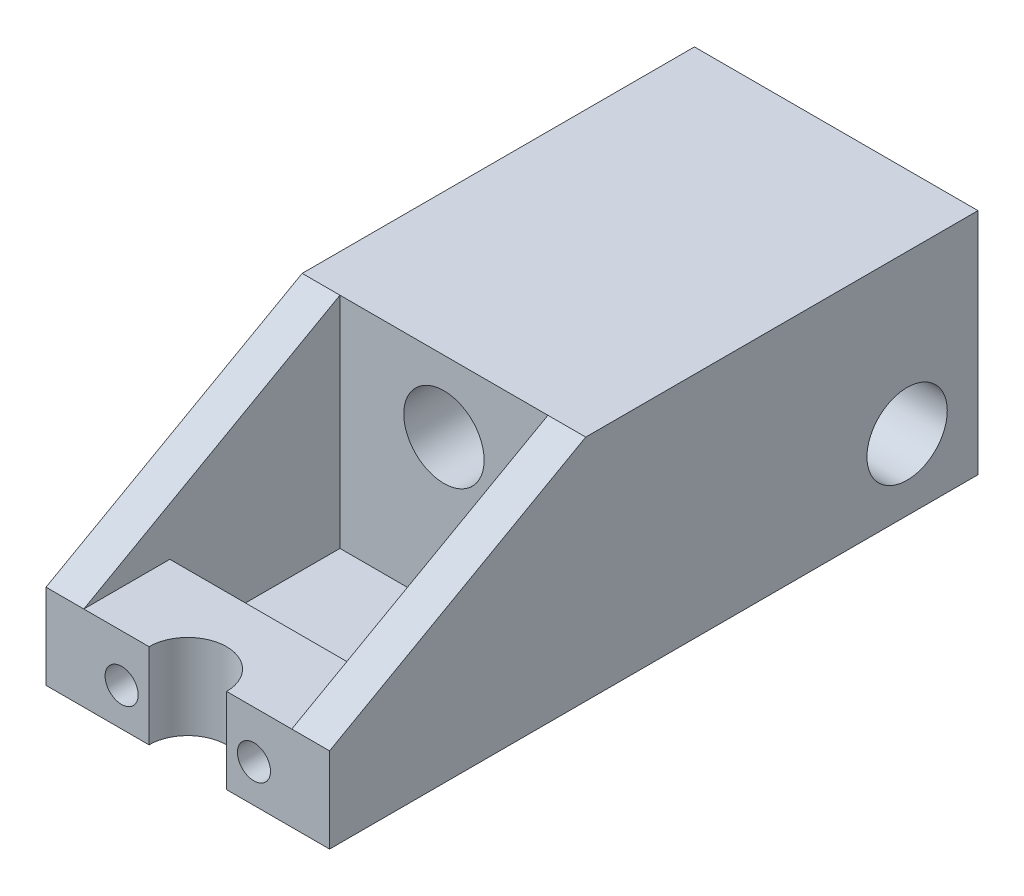
ISO-10303-21;
HEADER;
FILE_DESCRIPTION(('STEP AP214'),'2;1');
FILE_NAME('part.step','',(''),(''),'','','');
FILE_SCHEMA(('AUTOMOTIVE_DESIGN { 1 0 10303 214 1 1 1 1 }'));
ENDSEC;
DATA;
#1=APPLICATION_CONTEXT('core data for automotive mechanical design processes');
#2=APPLICATION_PROTOCOL_DEFINITION('international standard','automotive_design',2000,#1);
#3=PRODUCT_CONTEXT('',#1,'mechanical');
#4=PRODUCT('Part','Part','',(#3));
#5=PRODUCT_RELATED_PRODUCT_CATEGORY('part','',(#4));
#6=PRODUCT_DEFINITION_FORMATION('','',#4);
#7=PRODUCT_DEFINITION_CONTEXT('part definition',#1,'design');
#8=PRODUCT_DEFINITION('design','',#6,#7);
#9=PRODUCT_DEFINITION_SHAPE('','',#8);
#10=(LENGTH_UNIT() NAMED_UNIT(*) SI_UNIT(.MILLI.,.METRE.));
#11=(NAMED_UNIT(*) PLANE_ANGLE_UNIT() SI_UNIT($,.RADIAN.));
#12=(NAMED_UNIT(*) SI_UNIT($,.STERADIAN.) SOLID_ANGLE_UNIT());
#13=UNCERTAINTY_MEASURE_WITH_UNIT(LENGTH_MEASURE(1.E-05),#10,'distance_accuracy_value','');
#14=(GEOMETRIC_REPRESENTATION_CONTEXT(3) GLOBAL_UNCERTAINTY_ASSIGNED_CONTEXT((#13)) GLOBAL_UNIT_ASSIGNED_CONTEXT((#10,
#11,#12)) REPRESENTATION_CONTEXT('',''));
#15=CARTESIAN_POINT('',(0.,0.,0.));
#16=DIRECTION('',(0.,0.,1.));
#17=DIRECTION('',(1.,0.,0.));
#18=AXIS2_PLACEMENT_3D('',#15,#16,#17);
#19=CARTESIAN_POINT('',(-15.,-3.1,61.1));
#20=DIRECTION('',(0.,-1.,0.));
#21=DIRECTION('',(0.,0.,-1.));
#22=AXIS2_PLACEMENT_3D('',#19,#20,#21);
#23=PLANE('',#22);
#24=DIRECTION('',(-1.,0.,0.));
#25=VECTOR('',#24,1.);
#26=CARTESIAN_POINT('',(-15.,-3.1,61.1));
#27=LINE('',#26,#25);
#28=CARTESIAN_POINT('',(11.,-3.1,61.1));
#29=VERTEX_POINT('',#28);
#30=CARTESIAN_POINT('',(4.1,-3.1,61.1));
#31=VERTEX_POINT('',#30);
#32=EDGE_CURVE('E378',#29,#31,#27,.T.);
#33=ORIENTED_EDGE('',*,*,#32,.F.);
#34=DIRECTION('',(0.,0.,-1.));
#35=VECTOR('',#34,1.);
#36=CARTESIAN_POINT('',(11.,-3.1,61.1));
#37=LINE('',#36,#35);
#38=CARTESIAN_POINT('',(11.,-3.1,52.));
#39=VERTEX_POINT('',#38);
#40=EDGE_CURVE('E225',#29,#39,#37,.T.);
#41=ORIENTED_EDGE('',*,*,#40,.T.);
#42=DIRECTION('',(1.,0.,0.));
#43=VECTOR('',#42,1.);
#44=CARTESIAN_POINT('',(11.,-3.1,52.));
#45=LINE('',#44,#43);
#46=CARTESIAN_POINT('',(-11.,-3.1,52.));
#47=VERTEX_POINT('',#46);
#48=EDGE_CURVE('E337',#47,#39,#45,.T.);
#49=ORIENTED_EDGE('',*,*,#48,.F.);
#50=DIRECTION('',(0.,0.,1.));
#51=VECTOR('',#50,1.);
#52=CARTESIAN_POINT('',(-11.,-3.1,61.1));
#53=LINE('',#52,#51);
#54=CARTESIAN_POINT('',(-11.,-3.1,61.1));
#55=VERTEX_POINT('',#54);
#56=EDGE_CURVE('E52',#47,#55,#53,.T.);
#57=ORIENTED_EDGE('',*,*,#56,.T.);
#58=CARTESIAN_POINT('',(-4.1,-3.1,61.1));
#59=VERTEX_POINT('',#58);
#60=EDGE_CURVE('E373',#59,#55,#27,.T.);
#61=ORIENTED_EDGE('',*,*,#60,.F.);
#62=CARTESIAN_POINT('',(0.,-3.1,61.1));
#63=DIRECTION('',(0.,1.,0.));
#64=DIRECTION('',(0.,0.,1.));
#65=AXIS2_PLACEMENT_3D('',#62,#63,#64);
#66=CIRCLE('',#65,4.1);
#67=EDGE_CURVE('E355',#31,#59,#66,.T.);
#68=ORIENTED_EDGE('',*,*,#67,.F.);
#69=EDGE_LOOP('',(#33,#41,#49,#57,#61,#68));
#70=FACE_BOUND('',#69,.T.);
#71=ADVANCED_FACE('F35',(#70),#23,.F.);
#72=CARTESIAN_POINT('',(11.,-11.1,34.));
#73=DIRECTION('',(0.,0.,-1.));
#74=DIRECTION('',(-1.,0.,0.));
#75=AXIS2_PLACEMENT_3D('',#72,#73,#74);
#76=PLANE('',#75);
#77=CARTESIAN_POINT('',(0.,4.6,34.));
#78=DIRECTION('',(0.,0.,1.));
#79=DIRECTION('',(1.,0.,0.));
#80=AXIS2_PLACEMENT_3D('',#77,#78,#79);
#81=CIRCLE('',#80,4.25);
#82=CARTESIAN_POINT('',(4.25,4.6,34.));
#83=VERTEX_POINT('',#82);
#84=EDGE_CURVE('E233',#83,#83,#81,.F.);
#85=ORIENTED_EDGE('',*,*,#84,.T.);
#86=EDGE_LOOP('',(#85));
#87=FACE_BOUND('',#86,.T.);
#88=DIRECTION('',(0.,1.,0.));
#89=VECTOR('',#88,1.);
#90=CARTESIAN_POINT('',(11.,-11.1,34.));
#91=LINE('',#90,#89);
#92=CARTESIAN_POINT('',(11.,-11.1,34.));
#93=VERTEX_POINT('',#92);
#94=CARTESIAN_POINT('',(11.,12.1,34.));
#95=VERTEX_POINT('',#94);
#96=EDGE_CURVE('E198',#93,#95,#91,.T.);
#97=ORIENTED_EDGE('',*,*,#96,.T.);
#98=DIRECTION('',(-1.,0.,0.));
#99=VECTOR('',#98,1.);
#100=CARTESIAN_POINT('',(0.,12.1,34.));
#101=LINE('',#100,#99);
#102=CARTESIAN_POINT('',(-11.,12.1,34.));
#103=VERTEX_POINT('',#102);
#104=EDGE_CURVE('E60',#95,#103,#101,.T.);
#105=ORIENTED_EDGE('',*,*,#104,.T.);
#106=DIRECTION('',(0.,1.,0.));
#107=VECTOR('',#106,1.);
#108=CARTESIAN_POINT('',(-11.,-11.1,34.));
#109=LINE('',#108,#107);
#110=CARTESIAN_POINT('',(-11.,-11.1,34.));
#111=VERTEX_POINT('',#110);
#112=EDGE_CURVE('E207',#111,#103,#109,.T.);
#113=ORIENTED_EDGE('',*,*,#112,.F.);
#114=DIRECTION('',(-1.,0.,0.));
#115=VECTOR('',#114,1.);
#116=CARTESIAN_POINT('',(11.,-11.1,34.));
#117=LINE('',#116,#115);
#118=EDGE_CURVE('E202',#93,#111,#117,.T.);
#119=ORIENTED_EDGE('',*,*,#118,.F.);
#120=EDGE_LOOP('',(#97,#105,#113,#119));
#121=FACE_BOUND('',#120,.T.);
#122=ADVANCED_FACE('F200',(#87,#121),#76,.F.);
#123=CARTESIAN_POINT('',(11.,-11.1,52.));
#124=DIRECTION('',(0.,0.,1.));
#125=DIRECTION('',(1.,0.,0.));
#126=AXIS2_PLACEMENT_3D('',#123,#124,#125);
#127=PLANE('',#126);
#128=ORIENTED_EDGE('',*,*,#48,.T.);
#129=DIRECTION('',(0.,1.,0.));
#130=VECTOR('',#129,1.);
#131=CARTESIAN_POINT('',(11.,-11.1,52.));
#132=LINE('',#131,#130);
#133=CARTESIAN_POINT('',(11.,-11.1,52.));
#134=VERTEX_POINT('',#133);
#135=EDGE_CURVE('E208',#134,#39,#132,.T.);
#136=ORIENTED_EDGE('',*,*,#135,.F.);
#137=DIRECTION('',(1.,0.,0.));
#138=VECTOR('',#137,1.);
#139=CARTESIAN_POINT('',(11.,-11.1,52.));
#140=LINE('',#139,#138);
#141=CARTESIAN_POINT('',(-11.,-11.1,52.));
#142=VERTEX_POINT('',#141);
#143=EDGE_CURVE('E338',#142,#134,#140,.T.);
#144=ORIENTED_EDGE('',*,*,#143,.F.);
#145=DIRECTION('',(0.,1.,0.));
#146=VECTOR('',#145,1.);
#147=CARTESIAN_POINT('',(-11.,-11.1,52.));
#148=LINE('',#147,#146);
#149=EDGE_CURVE('E349',#142,#47,#148,.T.);
#150=ORIENTED_EDGE('',*,*,#149,.T.);
#151=EDGE_LOOP('',(#128,#136,#144,#150));
#152=FACE_BOUND('',#151,.T.);
#153=DIRECTION('',(0.5,0.866025403784439,0.));
#154=VECTOR('',#153,1.);
#155=CARTESIAN_POINT('',(3.75,-8.1,52.));
#156=LINE('',#155,#154);
#157=CARTESIAN_POINT('',(3.75,-8.1,52.));
#158=VERTEX_POINT('',#157);
#159=CARTESIAN_POINT('',(5.375,-5.28541743770058,52.));
#160=VERTEX_POINT('',#159);
#161=EDGE_CURVE('E304',#158,#160,#156,.T.);
#162=ORIENTED_EDGE('',*,*,#161,.F.);
#163=DIRECTION('',(-0.5,0.866025403784439,0.));
#164=VECTOR('',#163,1.);
#165=CARTESIAN_POINT('',(5.375,-10.9145825622994,52.));
#166=LINE('',#165,#164);
#167=CARTESIAN_POINT('',(5.375,-10.9145825622994,52.));
#168=VERTEX_POINT('',#167);
#169=EDGE_CURVE('E302',#168,#158,#166,.T.);
#170=ORIENTED_EDGE('',*,*,#169,.F.);
#171=DIRECTION('',(-1.,0.,0.));
#172=VECTOR('',#171,1.);
#173=CARTESIAN_POINT('',(8.625,-10.9145825622994,52.));
#174=LINE('',#173,#172);
#175=CARTESIAN_POINT('',(8.625,-10.9145825622994,52.));
#176=VERTEX_POINT('',#175);
#177=EDGE_CURVE('E286',#176,#168,#174,.T.);
#178=ORIENTED_EDGE('',*,*,#177,.F.);
#179=DIRECTION('',(-0.5,-0.866025403784439,0.));
#180=VECTOR('',#179,1.);
#181=CARTESIAN_POINT('',(10.25,-8.1,52.));
#182=LINE('',#181,#180);
#183=CARTESIAN_POINT('',(10.25,-8.1,52.));
#184=VERTEX_POINT('',#183);
#185=EDGE_CURVE('E313',#184,#176,#182,.T.);
#186=ORIENTED_EDGE('',*,*,#185,.F.);
#187=DIRECTION('',(0.5,-0.866025403784438,0.));
#188=VECTOR('',#187,1.);
#189=CARTESIAN_POINT('',(8.625,-5.28541743770058,52.));
#190=LINE('',#189,#188);
#191=CARTESIAN_POINT('',(8.625,-5.28541743770058,52.));
#192=VERTEX_POINT('',#191);
#193=EDGE_CURVE('E310',#192,#184,#190,.T.);
#194=ORIENTED_EDGE('',*,*,#193,.F.);
#195=DIRECTION('',(1.,0.,0.));
#196=VECTOR('',#195,1.);
#197=CARTESIAN_POINT('',(5.375,-5.28541743770058,52.));
#198=LINE('',#197,#196);
#199=EDGE_CURVE('E307',#160,#192,#198,.T.);
#200=ORIENTED_EDGE('',*,*,#199,.F.);
#201=EDGE_LOOP('',(#162,#170,#178,#186,#194,#200));
#202=FACE_BOUND('',#201,.T.);
#203=DIRECTION('',(0.5,0.866025403784439,0.));
#204=VECTOR('',#203,1.);
#205=CARTESIAN_POINT('',(-5.375,-10.9145825622994,52.));
#206=LINE('',#205,#204);
#207=CARTESIAN_POINT('',(-5.375,-10.9145825622994,52.));
#208=VERTEX_POINT('',#207);
#209=CARTESIAN_POINT('',(-3.75,-8.1,52.));
#210=VERTEX_POINT('',#209);
#211=EDGE_CURVE('E268',#208,#210,#206,.T.);
#212=ORIENTED_EDGE('',*,*,#211,.T.);
#213=DIRECTION('',(-0.5,0.866025403784439,0.));
#214=VECTOR('',#213,1.);
#215=CARTESIAN_POINT('',(-3.75,-8.1,52.));
#216=LINE('',#215,#214);
#217=CARTESIAN_POINT('',(-5.375,-5.28541743770058,52.));
#218=VERTEX_POINT('',#217);
#219=EDGE_CURVE('E265',#210,#218,#216,.T.);
#220=ORIENTED_EDGE('',*,*,#219,.T.);
#221=DIRECTION('',(-1.,0.,0.));
#222=VECTOR('',#221,1.);
#223=CARTESIAN_POINT('',(-5.375,-5.28541743770058,52.));
#224=LINE('',#223,#222);
#225=CARTESIAN_POINT('',(-8.625,-5.28541743770058,52.));
#226=VERTEX_POINT('',#225);
#227=EDGE_CURVE('E262',#218,#226,#224,.T.);
#228=ORIENTED_EDGE('',*,*,#227,.T.);
#229=DIRECTION('',(-0.5,-0.866025403784438,0.));
#230=VECTOR('',#229,1.);
#231=CARTESIAN_POINT('',(-8.625,-5.28541743770058,52.));
#232=LINE('',#231,#230);
#233=CARTESIAN_POINT('',(-10.25,-8.1,52.));
#234=VERTEX_POINT('',#233);
#235=EDGE_CURVE('E259',#226,#234,#232,.T.);
#236=ORIENTED_EDGE('',*,*,#235,.T.);
#237=DIRECTION('',(0.5,-0.866025403784439,0.));
#238=VECTOR('',#237,1.);
#239=CARTESIAN_POINT('',(-10.25,-8.1,52.));
#240=LINE('',#239,#238);
#241=CARTESIAN_POINT('',(-8.625,-10.9145825622994,52.));
#242=VERTEX_POINT('',#241);
#243=EDGE_CURVE('E255',#234,#242,#240,.T.);
#244=ORIENTED_EDGE('',*,*,#243,.T.);
#245=DIRECTION('',(1.,0.,0.));
#246=VECTOR('',#245,1.);
#247=CARTESIAN_POINT('',(-8.625,-10.9145825622994,52.));
#248=LINE('',#247,#246);
#249=EDGE_CURVE('E252',#242,#208,#248,.T.);
#250=ORIENTED_EDGE('',*,*,#249,.T.);
#251=EDGE_LOOP('',(#212,#220,#228,#236,#244,#250));
#252=FACE_BOUND('',#251,.T.);
#253=ADVANCED_FACE('F410',(#152,#202,#252),#127,.F.);
#254=CARTESIAN_POINT('',(7.,-8.1,-7.50099999999999));
#255=DIRECTION('',(0.,0.,1.));
#256=DIRECTION('',(1.,0.,0.));
#257=AXIS2_PLACEMENT_3D('',#254,#255,#256);
#258=CYLINDRICAL_SURFACE('',#257,1.75);
#259=CARTESIAN_POINT('',(7.,-8.1,61.1));
#260=DIRECTION('',(0.,0.,1.));
#261=DIRECTION('',(-1.,0.,0.));
#262=AXIS2_PLACEMENT_3D('',#259,#260,#261);
#263=CIRCLE('',#262,1.75);
#264=CARTESIAN_POINT('',(5.25,-8.1,61.1));
#265=VERTEX_POINT('',#264);
#266=EDGE_CURVE('E331',#265,#265,#263,.T.);
#267=ORIENTED_EDGE('',*,*,#266,.T.);
#268=EDGE_LOOP('',(#267));
#269=FACE_BOUND('',#268,.T.);
#270=CARTESIAN_POINT('',(7.,-8.1,55.1));
#271=DIRECTION('',(0.,0.,-1.));
#272=DIRECTION('',(-1.,0.,0.));
#273=AXIS2_PLACEMENT_3D('',#270,#271,#272);
#274=CIRCLE('',#273,1.75);
#275=CARTESIAN_POINT('',(5.25,-8.1,55.1));
#276=VERTEX_POINT('',#275);
#277=EDGE_CURVE('E320',#276,#276,#274,.F.);
#278=ORIENTED_EDGE('',*,*,#277,.F.);
#279=EDGE_LOOP('',(#278));
#280=FACE_BOUND('',#279,.T.);
#281=ADVANCED_FACE('F407',(#269,#280),#258,.F.);
#282=CARTESIAN_POINT('',(0.,0.,61.1));
#283=DIRECTION('',(0.,0.,-1.));
#284=DIRECTION('',(-1.,0.,0.));
#285=AXIS2_PLACEMENT_3D('',#282,#283,#284);
#286=PLANE('',#285);
#287=CARTESIAN_POINT('',(-7.,-8.1,61.1));
#288=DIRECTION('',(0.,0.,1.));
#289=DIRECTION('',(1.,0.,0.));
#290=AXIS2_PLACEMENT_3D('',#287,#288,#289);
#291=CIRCLE('',#290,1.75);
#292=CARTESIAN_POINT('',(-5.25,-8.1,61.1));
#293=VERTEX_POINT('',#292);
#294=EDGE_CURVE('E334',#293,#293,#291,.T.);
#295=ORIENTED_EDGE('',*,*,#294,.F.);
#296=EDGE_LOOP('',(#295));
#297=FACE_BOUND('',#296,.T.);
#298=DIRECTION('',(1.,0.,0.));
#299=VECTOR('',#298,1.);
#300=CARTESIAN_POINT('',(-15.,-12.1,61.1));
#301=LINE('',#300,#299);
#302=CARTESIAN_POINT('',(-15.,-12.1,61.1));
#303=VERTEX_POINT('',#302);
#304=CARTESIAN_POINT('',(-4.1,-12.1,61.1));
#305=VERTEX_POINT('',#304);
#306=EDGE_CURVE('E367',#303,#305,#301,.T.);
#307=ORIENTED_EDGE('',*,*,#306,.T.);
#308=DIRECTION('',(0.,1.,0.));
#309=VECTOR('',#308,1.);
#310=CARTESIAN_POINT('',(-4.1,-12.101,61.1));
#311=LINE('',#310,#309);
#312=EDGE_CURVE('E357',#305,#59,#311,.T.);
#313=ORIENTED_EDGE('',*,*,#312,.T.);
#314=ORIENTED_EDGE('',*,*,#60,.T.);
#315=DIRECTION('',(-1.,0.,0.));
#316=VECTOR('',#315,1.);
#317=CARTESIAN_POINT('',(-11.,-3.1,61.1));
#318=LINE('',#317,#316);
#319=CARTESIAN_POINT('',(-15.,-3.1,61.1));
#320=VERTEX_POINT('',#319);
#321=EDGE_CURVE('E469',#55,#320,#318,.T.);
#322=ORIENTED_EDGE('',*,*,#321,.T.);
#323=DIRECTION('',(0.,-1.,0.));
#324=VECTOR('',#323,1.);
#325=CARTESIAN_POINT('',(-15.,-12.1,61.1));
#326=LINE('',#325,#324);
#327=EDGE_CURVE('E361',#320,#303,#326,.T.);
#328=ORIENTED_EDGE('',*,*,#327,.T.);
#329=EDGE_LOOP('',(#307,#313,#314,#322,#328));
#330=FACE_BOUND('',#329,.T.);
#331=ADVANCED_FACE('F409',(#297,#330),#286,.F.);
#332=CARTESIAN_POINT('',(0.,0.,-7.5));
#333=DIRECTION('',(0.,0.,1.));
#334=DIRECTION('',(1.,0.,0.));
#335=AXIS2_PLACEMENT_3D('',#332,#333,#334);
#336=PLANE('',#335);
#337=DIRECTION('',(0.,-1.,0.));
#338=VECTOR('',#337,1.);
#339=CARTESIAN_POINT('',(-15.,-12.1,-7.5));
#340=LINE('',#339,#338);
#341=CARTESIAN_POINT('',(-15.,12.1,-7.5));
#342=VERTEX_POINT('',#341);
#343=CARTESIAN_POINT('',(-15.,-12.1,-7.5));
#344=VERTEX_POINT('',#343);
#345=EDGE_CURVE('E387',#342,#344,#340,.T.);
#346=ORIENTED_EDGE('',*,*,#345,.F.);
#347=DIRECTION('',(-1.,0.,0.));
#348=VECTOR('',#347,1.);
#349=CARTESIAN_POINT('',(15.,12.1,-7.5));
#350=LINE('',#349,#348);
#351=CARTESIAN_POINT('',(15.,12.1,-7.5));
#352=VERTEX_POINT('',#351);
#353=EDGE_CURVE('E394',#352,#342,#350,.T.);
#354=ORIENTED_EDGE('',*,*,#353,.F.);
#355=DIRECTION('',(0.,1.,0.));
#356=VECTOR('',#355,1.);
#357=CARTESIAN_POINT('',(15.,-12.1,-7.5));
#358=LINE('',#357,#356);
#359=CARTESIAN_POINT('',(15.,-12.1,-7.5));
#360=VERTEX_POINT('',#359);
#361=EDGE_CURVE('E392',#360,#352,#358,.T.);
#362=ORIENTED_EDGE('',*,*,#361,.F.);
#363=DIRECTION('',(1.,0.,0.));
#364=VECTOR('',#363,1.);
#365=CARTESIAN_POINT('',(15.,-12.1,-7.5));
#366=LINE('',#365,#364);
#367=EDGE_CURVE('E390',#344,#360,#366,.T.);
#368=ORIENTED_EDGE('',*,*,#367,.F.);
#369=EDGE_LOOP('',(#346,#354,#362,#368));
#370=FACE_BOUND('',#369,.T.);
#371=CARTESIAN_POINT('',(0.,4.6,-7.5));
#372=DIRECTION('',(0.,0.,1.));
#373=DIRECTION('',(1.,0.,0.));
#374=AXIS2_PLACEMENT_3D('',#371,#372,#373);
#375=CIRCLE('',#374,4.25);
#376=CARTESIAN_POINT('',(4.25,4.6,-7.5));
#377=VERTEX_POINT('',#376);
#378=EDGE_CURVE('E384',#377,#377,#375,.T.);
#379=ORIENTED_EDGE('',*,*,#378,.T.);
#380=EDGE_LOOP('',(#379));
#381=FACE_BOUND('',#380,.T.);
#382=ADVANCED_FACE('F417',(#370,#381),#336,.F.);
#383=CARTESIAN_POINT('',(-15.,-12.1,7.5));
#384=DIRECTION('',(1.,0.,0.));
#385=DIRECTION('',(0.,0.,-1.));
#386=AXIS2_PLACEMENT_3D('',#383,#384,#385);
#387=PLANE('',#386);
#388=CARTESIAN_POINT('',(-15.,-4.6,0.));
#389=DIRECTION('',(1.,0.,0.));
#390=DIRECTION('',(0.,0.,-1.));
#391=AXIS2_PLACEMENT_3D('',#388,#389,#390);
#392=CIRCLE('',#391,4.25);
#393=CARTESIAN_POINT('',(-15.,-4.6,-4.25));
#394=VERTEX_POINT('',#393);
#395=EDGE_CURVE('E381',#394,#394,#392,.F.);
#396=ORIENTED_EDGE('',*,*,#395,.F.);
#397=EDGE_LOOP('',(#396));
#398=FACE_BOUND('',#397,.T.);
#399=ORIENTED_EDGE('',*,*,#345,.T.);
#400=DIRECTION('',(0.,0.,-1.));
#401=VECTOR('',#400,1.);
#402=CARTESIAN_POINT('',(-15.,-12.1,7.5));
#403=LINE('',#402,#401);
#404=EDGE_CURVE('E11',#303,#344,#403,.T.);
#405=ORIENTED_EDGE('',*,*,#404,.F.);
#406=ORIENTED_EDGE('',*,*,#327,.F.);
#407=DIRECTION('',(0.,0.489191265938875,-0.872176533351546));
#408=VECTOR('',#407,1.);
#409=CARTESIAN_POINT('',(-15.,12.1,34.));
#410=LINE('',#409,#408);
#411=CARTESIAN_POINT('',(-15.,12.1,34.));
#412=VERTEX_POINT('',#411);
#413=EDGE_CURVE('E477',#320,#412,#410,.T.);
#414=ORIENTED_EDGE('',*,*,#413,.T.);
#415=DIRECTION('',(0.,0.,-1.));
#416=VECTOR('',#415,1.);
#417=CARTESIAN_POINT('',(-15.,12.1,7.5));
#418=LINE('',#417,#416);
#419=EDGE_CURVE('E396',#412,#342,#418,.T.);
#420=ORIENTED_EDGE('',*,*,#419,.T.);
#421=EDGE_LOOP('',(#399,#405,#406,#414,#420));
#422=FACE_BOUND('',#421,.T.);
#423=ADVANCED_FACE('F37',(#398,#422),#387,.F.);
#424=CARTESIAN_POINT('',(15.,-12.1,7.5));
#425=DIRECTION('',(0.,1.,0.));
#426=DIRECTION('',(0.,0.,1.));
#427=AXIS2_PLACEMENT_3D('',#424,#425,#426);
#428=PLANE('',#427);
#429=CARTESIAN_POINT('',(4.1,-12.1,61.1));
#430=VERTEX_POINT('',#429);
#431=CARTESIAN_POINT('',(15.,-12.1,61.1));
#432=VERTEX_POINT('',#431);
#433=EDGE_CURVE('E366',#430,#432,#301,.T.);
#434=ORIENTED_EDGE('',*,*,#433,.F.);
#435=CARTESIAN_POINT('',(0.,-12.1,61.1));
#436=DIRECTION('',(0.,1.,0.));
#437=DIRECTION('',(0.,0.,1.));
#438=AXIS2_PLACEMENT_3D('',#435,#436,#437);
#439=CIRCLE('',#438,4.1);
#440=EDGE_CURVE('E351',#305,#430,#439,.F.);
#441=ORIENTED_EDGE('',*,*,#440,.F.);
#442=ORIENTED_EDGE('',*,*,#306,.F.);
#443=ORIENTED_EDGE('',*,*,#404,.T.);
#444=ORIENTED_EDGE('',*,*,#367,.T.);
#445=DIRECTION('',(0.,0.,-1.));
#446=VECTOR('',#445,1.);
#447=CARTESIAN_POINT('',(15.,-12.1,7.5));
#448=LINE('',#447,#446);
#449=EDGE_CURVE('E44',#432,#360,#448,.T.);
#450=ORIENTED_EDGE('',*,*,#449,.F.);
#451=EDGE_LOOP('',(#434,#441,#442,#443,#444,#450));
#452=FACE_BOUND('',#451,.T.);
#453=ADVANCED_FACE('F449',(#452),#428,.F.);
#454=CARTESIAN_POINT('',(15.,-12.1,7.5));
#455=DIRECTION('',(-1.,0.,0.));
#456=DIRECTION('',(0.,0.,1.));
#457=AXIS2_PLACEMENT_3D('',#454,#455,#456);
#458=PLANE('',#457);
#459=DIRECTION('',(0.,0.,-1.));
#460=VECTOR('',#459,1.);
#461=CARTESIAN_POINT('',(15.,12.1,7.5));
#462=LINE('',#461,#460);
#463=CARTESIAN_POINT('',(15.,12.1,34.));
#464=VERTEX_POINT('',#463);
#465=EDGE_CURVE('E399',#464,#352,#462,.T.);
#466=ORIENTED_EDGE('',*,*,#465,.F.);
#467=DIRECTION('',(0.,-0.489191265938875,0.872176533351546));
#468=VECTOR('',#467,1.);
#469=CARTESIAN_POINT('',(15.,12.1,34.));
#470=LINE('',#469,#468);
#471=CARTESIAN_POINT('',(15.,-3.1,61.1));
#472=VERTEX_POINT('',#471);
#473=EDGE_CURVE('E217',#464,#472,#470,.T.);
#474=ORIENTED_EDGE('',*,*,#473,.T.);
#475=DIRECTION('',(0.,1.,0.));
#476=VECTOR('',#475,1.);
#477=CARTESIAN_POINT('',(15.,-12.1,61.1));
#478=LINE('',#477,#476);
#479=EDGE_CURVE('E370',#432,#472,#478,.T.);
#480=ORIENTED_EDGE('',*,*,#479,.F.);
#481=ORIENTED_EDGE('',*,*,#449,.T.);
#482=ORIENTED_EDGE('',*,*,#361,.T.);
#483=EDGE_LOOP('',(#466,#474,#480,#481,#482));
#484=FACE_BOUND('',#483,.T.);
#485=CARTESIAN_POINT('',(15.,-4.6,0.));
#486=DIRECTION('',(1.,0.,0.));
#487=DIRECTION('',(0.,0.,-1.));
#488=AXIS2_PLACEMENT_3D('',#485,#486,#487);
#489=CIRCLE('',#488,4.25);
#490=CARTESIAN_POINT('',(15.,-4.6,-4.25));
#491=VERTEX_POINT('',#490);
#492=EDGE_CURVE('E377',#491,#491,#489,.T.);
#493=ORIENTED_EDGE('',*,*,#492,.F.);
#494=EDGE_LOOP('',(#493));
#495=FACE_BOUND('',#494,.T.);
#496=ADVANCED_FACE('F447',(#484,#495),#458,.F.);
#497=CARTESIAN_POINT('',(15.,12.1,7.5));
#498=DIRECTION('',(0.,-1.,0.));
#499=DIRECTION('',(0.,0.,-1.));
#500=AXIS2_PLACEMENT_3D('',#497,#498,#499);
#501=PLANE('',#500);
#502=ORIENTED_EDGE('',*,*,#353,.T.);
#503=ORIENTED_EDGE('',*,*,#419,.F.);
#504=DIRECTION('',(-1.,0.,0.));
#505=VECTOR('',#504,1.);
#506=CARTESIAN_POINT('',(-11.,12.1,34.));
#507=LINE('',#506,#505);
#508=EDGE_CURVE('E231',#103,#412,#507,.T.);
#509=ORIENTED_EDGE('',*,*,#508,.F.);
#510=ORIENTED_EDGE('',*,*,#104,.F.);
#511=EDGE_CURVE('E212',#464,#95,#101,.T.);
#512=ORIENTED_EDGE('',*,*,#511,.F.);
#513=ORIENTED_EDGE('',*,*,#465,.T.);
#514=EDGE_LOOP('',(#502,#503,#509,#510,#512,#513));
#515=FACE_BOUND('',#514,.T.);
#516=ADVANCED_FACE('F229',(#515),#501,.F.);
#517=CARTESIAN_POINT('',(0.,4.6,7.5));
#518=DIRECTION('',(0.,0.,-1.));
#519=DIRECTION('',(-1.,0.,0.));
#520=AXIS2_PLACEMENT_3D('',#517,#518,#519);
#521=CYLINDRICAL_SURFACE('',#520,4.25);
#522=ORIENTED_EDGE('',*,*,#378,.F.);
#523=EDGE_LOOP('',(#522));
#524=FACE_BOUND('',#523,.T.);
#525=ORIENTED_EDGE('',*,*,#84,.F.);
#526=EDGE_LOOP('',(#525));
#527=FACE_BOUND('',#526,.T.);
#528=ADVANCED_FACE('F437',(#524,#527),#521,.F.);
#529=CARTESIAN_POINT('',(-15.001,-4.6,0.));
#530=DIRECTION('',(1.,0.,0.));
#531=DIRECTION('',(0.,0.,-1.));
#532=AXIS2_PLACEMENT_3D('',#529,#530,#531);
#533=CYLINDRICAL_SURFACE('',#532,4.25);
#534=ORIENTED_EDGE('',*,*,#492,.T.);
#535=EDGE_LOOP('',(#534));
#536=FACE_BOUND('',#535,.T.);
#537=ORIENTED_EDGE('',*,*,#395,.T.);
#538=EDGE_LOOP('',(#537));
#539=FACE_BOUND('',#538,.T.);
#540=ADVANCED_FACE('F434',(#536,#539),#533,.F.);
#541=ORIENTED_EDGE('',*,*,#266,.F.);
#542=EDGE_LOOP('',(#541));
#543=FACE_BOUND('',#542,.T.);
#544=EDGE_CURVE('E374',#472,#29,#27,.T.);
#545=ORIENTED_EDGE('',*,*,#544,.T.);
#546=ORIENTED_EDGE('',*,*,#32,.T.);
#547=DIRECTION('',(0.,1.,0.));
#548=VECTOR('',#547,1.);
#549=CARTESIAN_POINT('',(4.1,-12.101,61.1));
#550=LINE('',#549,#548);
#551=EDGE_CURVE('E358',#430,#31,#550,.T.);
#552=ORIENTED_EDGE('',*,*,#551,.F.);
#553=ORIENTED_EDGE('',*,*,#433,.T.);
#554=ORIENTED_EDGE('',*,*,#479,.T.);
#555=EDGE_LOOP('',(#545,#546,#552,#553,#554));
#556=FACE_BOUND('',#555,.T.);
#557=ADVANCED_FACE('F420',(#543,#556),#286,.F.);
#558=CARTESIAN_POINT('',(0.,-12.101,61.1));
#559=DIRECTION('',(0.,1.,0.));
#560=DIRECTION('',(0.,0.,1.));
#561=AXIS2_PLACEMENT_3D('',#558,#559,#560);
#562=CYLINDRICAL_SURFACE('',#561,4.1);
#563=ORIENTED_EDGE('',*,*,#440,.T.);
#564=ORIENTED_EDGE('',*,*,#551,.T.);
#565=ORIENTED_EDGE('',*,*,#67,.T.);
#566=ORIENTED_EDGE('',*,*,#312,.F.);
#567=EDGE_LOOP('',(#563,#564,#565,#566));
#568=FACE_BOUND('',#567,.T.);
#569=ADVANCED_FACE('F466',(#568),#562,.F.);
#570=CARTESIAN_POINT('',(-11.,-11.1,52.));
#571=DIRECTION('',(-1.,0.,0.));
#572=DIRECTION('',(0.,0.,1.));
#573=AXIS2_PLACEMENT_3D('',#570,#571,#572);
#574=PLANE('',#573);
#575=ORIENTED_EDGE('',*,*,#112,.T.);
#576=DIRECTION('',(0.,0.489191265938875,-0.872176533351546));
#577=VECTOR('',#576,1.);
#578=CARTESIAN_POINT('',(-11.,12.1,34.));
#579=LINE('',#578,#577);
#580=EDGE_CURVE('E475',#55,#103,#579,.T.);
#581=ORIENTED_EDGE('',*,*,#580,.F.);
#582=ORIENTED_EDGE('',*,*,#56,.F.);
#583=ORIENTED_EDGE('',*,*,#149,.F.);
#584=DIRECTION('',(0.,0.,1.));
#585=VECTOR('',#584,1.);
#586=CARTESIAN_POINT('',(-11.,-11.1,52.));
#587=LINE('',#586,#585);
#588=EDGE_CURVE('E344',#111,#142,#587,.T.);
#589=ORIENTED_EDGE('',*,*,#588,.F.);
#590=EDGE_LOOP('',(#575,#581,#582,#583,#589));
#591=FACE_BOUND('',#590,.T.);
#592=ADVANCED_FACE('F479',(#591),#574,.F.);
#593=CARTESIAN_POINT('',(11.,-11.1,52.));
#594=DIRECTION('',(1.,0.,0.));
#595=DIRECTION('',(0.,0.,-1.));
#596=AXIS2_PLACEMENT_3D('',#593,#594,#595);
#597=PLANE('',#596);
#598=ORIENTED_EDGE('',*,*,#135,.T.);
#599=ORIENTED_EDGE('',*,*,#40,.F.);
#600=DIRECTION('',(0.,-0.489191265938875,0.872176533351546));
#601=VECTOR('',#600,1.);
#602=CARTESIAN_POINT('',(11.,12.1,34.));
#603=LINE('',#602,#601);
#604=EDGE_CURVE('E214',#95,#29,#603,.T.);
#605=ORIENTED_EDGE('',*,*,#604,.F.);
#606=ORIENTED_EDGE('',*,*,#96,.F.);
#607=DIRECTION('',(0.,0.,-1.));
#608=VECTOR('',#607,1.);
#609=CARTESIAN_POINT('',(11.,-11.1,52.));
#610=LINE('',#609,#608);
#611=EDGE_CURVE('E341',#134,#93,#610,.T.);
#612=ORIENTED_EDGE('',*,*,#611,.F.);
#613=EDGE_LOOP('',(#598,#599,#605,#606,#612));
#614=FACE_BOUND('',#613,.T.);
#615=ADVANCED_FACE('F224',(#614),#597,.F.);
#616=CARTESIAN_POINT('',(0.,-11.1,0.));
#617=DIRECTION('',(0.,-1.,0.));
#618=DIRECTION('',(0.,0.,-1.));
#619=AXIS2_PLACEMENT_3D('',#616,#617,#618);
#620=PLANE('',#619);
#621=ORIENTED_EDGE('',*,*,#143,.T.);
#622=ORIENTED_EDGE('',*,*,#611,.T.);
#623=ORIENTED_EDGE('',*,*,#118,.T.);
#624=ORIENTED_EDGE('',*,*,#588,.T.);
#625=EDGE_LOOP('',(#621,#622,#623,#624));
#626=FACE_BOUND('',#625,.T.);
#627=ADVANCED_FACE('F496',(#626),#620,.F.);
#628=CARTESIAN_POINT('',(-7.,-8.1,-7.50099999999999));
#629=DIRECTION('',(0.,0.,1.));
#630=DIRECTION('',(1.,0.,0.));
#631=AXIS2_PLACEMENT_3D('',#628,#629,#630);
#632=CYLINDRICAL_SURFACE('',#631,1.75);
#633=CARTESIAN_POINT('',(-7.,-8.1,55.1));
#634=DIRECTION('',(0.,0.,1.));
#635=DIRECTION('',(1.,0.,0.));
#636=AXIS2_PLACEMENT_3D('',#633,#634,#635);
#637=CIRCLE('',#636,1.75);
#638=CARTESIAN_POINT('',(-5.25,-8.1,55.1));
#639=VERTEX_POINT('',#638);
#640=EDGE_CURVE('E39',#639,#639,#637,.F.);
#641=ORIENTED_EDGE('',*,*,#640,.T.);
#642=EDGE_LOOP('',(#641));
#643=FACE_BOUND('',#642,.T.);
#644=ORIENTED_EDGE('',*,*,#294,.T.);
#645=EDGE_LOOP('',(#644));
#646=FACE_BOUND('',#645,.T.);
#647=ADVANCED_FACE('F498',(#643,#646),#632,.F.);
#648=CARTESIAN_POINT('',(0.,0.,55.1));
#649=DIRECTION('',(0.,0.,-1.));
#650=DIRECTION('',(-1.,0.,0.));
#651=AXIS2_PLACEMENT_3D('',#648,#649,#650);
#652=PLANE('',#651);
#653=DIRECTION('',(-0.5,0.866025403784439,0.));
#654=VECTOR('',#653,1.);
#655=CARTESIAN_POINT('',(5.375,-10.9145825622994,55.1));
#656=LINE('',#655,#654);
#657=CARTESIAN_POINT('',(5.375,-10.9145825622994,55.1));
#658=VERTEX_POINT('',#657);
#659=CARTESIAN_POINT('',(3.75,-8.1,55.1));
#660=VERTEX_POINT('',#659);
#661=EDGE_CURVE('E282',#658,#660,#656,.T.);
#662=ORIENTED_EDGE('',*,*,#661,.T.);
#663=DIRECTION('',(0.5,0.866025403784439,0.));
#664=VECTOR('',#663,1.);
#665=CARTESIAN_POINT('',(3.75,-8.1,55.1));
#666=LINE('',#665,#664);
#667=CARTESIAN_POINT('',(5.375,-5.28541743770058,55.1));
#668=VERTEX_POINT('',#667);
#669=EDGE_CURVE('E285',#660,#668,#666,.T.);
#670=ORIENTED_EDGE('',*,*,#669,.T.);
#671=DIRECTION('',(1.,0.,0.));
#672=VECTOR('',#671,1.);
#673=CARTESIAN_POINT('',(5.375,-5.28541743770058,55.1));
#674=LINE('',#673,#672);
#675=CARTESIAN_POINT('',(8.625,-5.28541743770058,55.1));
#676=VERTEX_POINT('',#675);
#677=EDGE_CURVE('E289',#668,#676,#674,.T.);
#678=ORIENTED_EDGE('',*,*,#677,.T.);
#679=DIRECTION('',(0.5,-0.866025403784438,0.));
#680=VECTOR('',#679,1.);
#681=CARTESIAN_POINT('',(8.625,-5.28541743770058,55.1));
#682=LINE('',#681,#680);
#683=CARTESIAN_POINT('',(10.25,-8.1,55.1));
#684=VERTEX_POINT('',#683);
#685=EDGE_CURVE('E292',#676,#684,#682,.T.);
#686=ORIENTED_EDGE('',*,*,#685,.T.);
#687=DIRECTION('',(-0.5,-0.866025403784439,0.));
#688=VECTOR('',#687,1.);
#689=CARTESIAN_POINT('',(10.25,-8.1,55.1));
#690=LINE('',#689,#688);
#691=CARTESIAN_POINT('',(8.625,-10.9145825622994,55.1));
#692=VERTEX_POINT('',#691);
#693=EDGE_CURVE('E295',#684,#692,#690,.T.);
#694=ORIENTED_EDGE('',*,*,#693,.T.);
#695=DIRECTION('',(-1.,0.,0.));
#696=VECTOR('',#695,1.);
#697=CARTESIAN_POINT('',(8.625,-10.9145825622994,55.1));
#698=LINE('',#697,#696);
#699=EDGE_CURVE('E298',#692,#658,#698,.T.);
#700=ORIENTED_EDGE('',*,*,#699,.T.);
#701=EDGE_LOOP('',(#662,#670,#678,#686,#694,#700));
#702=FACE_BOUND('',#701,.T.);
#703=ORIENTED_EDGE('',*,*,#277,.T.);
#704=EDGE_LOOP('',(#703));
#705=FACE_BOUND('',#704,.T.);
#706=ADVANCED_FACE('F405',(#702,#705),#652,.T.);
#707=CARTESIAN_POINT('',(5.375,-10.9145825622994,55.1));
#708=DIRECTION('',(-0.866025403784439,-0.5,0.));
#709=DIRECTION('',(0.5,-0.866025403784439,0.));
#710=AXIS2_PLACEMENT_3D('',#707,#708,#709);
#711=PLANE('',#710);
#712=ORIENTED_EDGE('',*,*,#169,.T.);
#713=DIRECTION('',(0.,0.,-1.));
#714=VECTOR('',#713,1.);
#715=CARTESIAN_POINT('',(3.75,-8.1,55.1));
#716=LINE('',#715,#714);
#717=EDGE_CURVE('E301',#660,#158,#716,.T.);
#718=ORIENTED_EDGE('',*,*,#717,.F.);
#719=ORIENTED_EDGE('',*,*,#661,.F.);
#720=DIRECTION('',(0.,0.,-1.));
#721=VECTOR('',#720,1.);
#722=CARTESIAN_POINT('',(5.375,-10.9145825622994,55.1));
#723=LINE('',#722,#721);
#724=EDGE_CURVE('E318',#658,#168,#723,.T.);
#725=ORIENTED_EDGE('',*,*,#724,.T.);
#726=EDGE_LOOP('',(#712,#718,#719,#725));
#727=FACE_BOUND('',#726,.T.);
#728=ADVANCED_FACE('F745',(#727),#711,.F.);
#729=CARTESIAN_POINT('',(8.625,-10.9145825622994,55.1));
#730=DIRECTION('',(0.,-1.,0.));
#731=DIRECTION('',(0.,0.,-1.));
#732=AXIS2_PLACEMENT_3D('',#729,#730,#731);
#733=PLANE('',#732);
#734=ORIENTED_EDGE('',*,*,#177,.T.);
#735=ORIENTED_EDGE('',*,*,#724,.F.);
#736=ORIENTED_EDGE('',*,*,#699,.F.);
#737=DIRECTION('',(0.,0.,-1.));
#738=VECTOR('',#737,1.);
#739=CARTESIAN_POINT('',(8.625,-10.9145825622994,55.1));
#740=LINE('',#739,#738);
#741=EDGE_CURVE('E321',#692,#176,#740,.T.);
#742=ORIENTED_EDGE('',*,*,#741,.T.);
#743=EDGE_LOOP('',(#734,#735,#736,#742));
#744=FACE_BOUND('',#743,.T.);
#745=ADVANCED_FACE('F736',(#744),#733,.F.);
#746=CARTESIAN_POINT('',(10.25,-8.1,55.1));
#747=DIRECTION('',(0.866025403784438,-0.5,0.));
#748=DIRECTION('',(0.5,0.866025403784439,0.));
#749=AXIS2_PLACEMENT_3D('',#746,#747,#748);
#750=PLANE('',#749);
#751=ORIENTED_EDGE('',*,*,#185,.T.);
#752=ORIENTED_EDGE('',*,*,#741,.F.);
#753=ORIENTED_EDGE('',*,*,#693,.F.);
#754=DIRECTION('',(0.,0.,-1.));
#755=VECTOR('',#754,1.);
#756=CARTESIAN_POINT('',(10.25,-8.1,55.1));
#757=LINE('',#756,#755);
#758=EDGE_CURVE('E323',#684,#184,#757,.T.);
#759=ORIENTED_EDGE('',*,*,#758,.T.);
#760=EDGE_LOOP('',(#751,#752,#753,#759));
#761=FACE_BOUND('',#760,.T.);
#762=ADVANCED_FACE('F727',(#761),#750,.F.);
#763=CARTESIAN_POINT('',(8.625,-5.28541743770058,55.1));
#764=DIRECTION('',(0.866025403784438,0.5,0.));
#765=DIRECTION('',(-0.5,0.866025403784439,0.));
#766=AXIS2_PLACEMENT_3D('',#763,#764,#765);
#767=PLANE('',#766);
#768=ORIENTED_EDGE('',*,*,#193,.T.);
#769=ORIENTED_EDGE('',*,*,#758,.F.);
#770=ORIENTED_EDGE('',*,*,#685,.F.);
#771=DIRECTION('',(0.,0.,-1.));
#772=VECTOR('',#771,1.);
#773=CARTESIAN_POINT('',(8.625,-5.28541743770058,55.1));
#774=LINE('',#773,#772);
#775=EDGE_CURVE('E325',#676,#192,#774,.T.);
#776=ORIENTED_EDGE('',*,*,#775,.T.);
#777=EDGE_LOOP('',(#768,#769,#770,#776));
#778=FACE_BOUND('',#777,.T.);
#779=ADVANCED_FACE('F718',(#778),#767,.F.);
#780=CARTESIAN_POINT('',(5.375,-5.28541743770058,55.1));
#781=DIRECTION('',(0.,1.,0.));
#782=DIRECTION('',(0.,0.,1.));
#783=AXIS2_PLACEMENT_3D('',#780,#781,#782);
#784=PLANE('',#783);
#785=ORIENTED_EDGE('',*,*,#199,.T.);
#786=ORIENTED_EDGE('',*,*,#775,.F.);
#787=ORIENTED_EDGE('',*,*,#677,.F.);
#788=DIRECTION('',(0.,0.,-1.));
#789=VECTOR('',#788,1.);
#790=CARTESIAN_POINT('',(5.375,-5.28541743770058,55.1));
#791=LINE('',#790,#789);
#792=EDGE_CURVE('E327',#668,#160,#791,.T.);
#793=ORIENTED_EDGE('',*,*,#792,.T.);
#794=EDGE_LOOP('',(#785,#786,#787,#793));
#795=FACE_BOUND('',#794,.T.);
#796=ADVANCED_FACE('F709',(#795),#784,.F.);
#797=CARTESIAN_POINT('',(3.75,-8.1,55.1));
#798=DIRECTION('',(-0.866025403784438,0.5,0.));
#799=DIRECTION('',(-0.5,-0.866025403784439,0.));
#800=AXIS2_PLACEMENT_3D('',#797,#798,#799);
#801=PLANE('',#800);
#802=ORIENTED_EDGE('',*,*,#161,.T.);
#803=ORIENTED_EDGE('',*,*,#792,.F.);
#804=ORIENTED_EDGE('',*,*,#669,.F.);
#805=ORIENTED_EDGE('',*,*,#717,.T.);
#806=EDGE_LOOP('',(#802,#803,#804,#805));
#807=FACE_BOUND('',#806,.T.);
#808=ADVANCED_FACE('F700',(#807),#801,.F.);
#809=CARTESIAN_POINT('',(0.,0.,55.1));
#810=DIRECTION('',(0.,0.,1.));
#811=DIRECTION('',(1.,0.,0.));
#812=AXIS2_PLACEMENT_3D('',#809,#810,#811);
#813=PLANE('',#812);
#814=DIRECTION('',(0.5,0.866025403784439,0.));
#815=VECTOR('',#814,1.);
#816=CARTESIAN_POINT('',(-5.375,-10.9145825622994,55.1));
#817=LINE('',#816,#815);
#818=CARTESIAN_POINT('',(-5.375,-10.9145825622994,55.1));
#819=VERTEX_POINT('',#818);
#820=CARTESIAN_POINT('',(-3.75,-8.1,55.1));
#821=VERTEX_POINT('',#820);
#822=EDGE_CURVE('E256',#819,#821,#817,.T.);
#823=ORIENTED_EDGE('',*,*,#822,.F.);
#824=DIRECTION('',(1.,0.,0.));
#825=VECTOR('',#824,1.);
#826=CARTESIAN_POINT('',(-8.625,-10.9145825622994,55.1));
#827=LINE('',#826,#825);
#828=CARTESIAN_POINT('',(-8.625,-10.9145825622994,55.1));
#829=VERTEX_POINT('',#828);
#830=EDGE_CURVE('E251',#829,#819,#827,.T.);
#831=ORIENTED_EDGE('',*,*,#830,.F.);
#832=DIRECTION('',(0.5,-0.866025403784439,0.));
#833=VECTOR('',#832,1.);
#834=CARTESIAN_POINT('',(-10.25,-8.1,55.1));
#835=LINE('',#834,#833);
#836=CARTESIAN_POINT('',(-10.25,-8.1,55.1));
#837=VERTEX_POINT('',#836);
#838=EDGE_CURVE('E272',#837,#829,#835,.T.);
#839=ORIENTED_EDGE('',*,*,#838,.F.);
#840=DIRECTION('',(-0.5,-0.866025403784438,0.));
#841=VECTOR('',#840,1.);
#842=CARTESIAN_POINT('',(-8.625,-5.28541743770058,55.1));
#843=LINE('',#842,#841);
#844=CARTESIAN_POINT('',(-8.625,-5.28541743770058,55.1));
#845=VERTEX_POINT('',#844);
#846=EDGE_CURVE('E274',#845,#837,#843,.T.);
#847=ORIENTED_EDGE('',*,*,#846,.F.);
#848=DIRECTION('',(-1.,0.,0.));
#849=VECTOR('',#848,1.);
#850=CARTESIAN_POINT('',(-5.375,-5.28541743770058,55.1));
#851=LINE('',#850,#849);
#852=CARTESIAN_POINT('',(-5.375,-5.28541743770058,55.1));
#853=VERTEX_POINT('',#852);
#854=EDGE_CURVE('E276',#853,#845,#851,.T.);
#855=ORIENTED_EDGE('',*,*,#854,.F.);
#856=DIRECTION('',(-0.5,0.866025403784439,0.));
#857=VECTOR('',#856,1.);
#858=CARTESIAN_POINT('',(-3.75,-8.1,55.1));
#859=LINE('',#858,#857);
#860=EDGE_CURVE('E278',#821,#853,#859,.T.);
#861=ORIENTED_EDGE('',*,*,#860,.F.);
#862=EDGE_LOOP('',(#823,#831,#839,#847,#855,#861));
#863=FACE_BOUND('',#862,.T.);
#864=ORIENTED_EDGE('',*,*,#640,.F.);
#865=EDGE_LOOP('',(#864));
#866=FACE_BOUND('',#865,.T.);
#867=ADVANCED_FACE('F691',(#863,#866),#813,.F.);
#868=CARTESIAN_POINT('',(-5.375,-10.9145825622994,55.1));
#869=DIRECTION('',(-0.866025403784439,0.5,0.));
#870=DIRECTION('',(-0.5,-0.866025403784439,0.));
#871=AXIS2_PLACEMENT_3D('',#868,#869,#870);
#872=PLANE('',#871);
#873=ORIENTED_EDGE('',*,*,#211,.F.);
#874=DIRECTION('',(0.,0.,-1.));
#875=VECTOR('',#874,1.);
#876=CARTESIAN_POINT('',(-5.375,-10.9145825622994,55.1));
#877=LINE('',#876,#875);
#878=EDGE_CURVE('E248',#819,#208,#877,.T.);
#879=ORIENTED_EDGE('',*,*,#878,.F.);
#880=ORIENTED_EDGE('',*,*,#822,.T.);
#881=DIRECTION('',(0.,0.,-1.));
#882=VECTOR('',#881,1.);
#883=CARTESIAN_POINT('',(-3.75,-8.1,55.1));
#884=LINE('',#883,#882);
#885=EDGE_CURVE('E221',#821,#210,#884,.T.);
#886=ORIENTED_EDGE('',*,*,#885,.T.);
#887=EDGE_LOOP('',(#873,#879,#880,#886));
#888=FACE_BOUND('',#887,.T.);
#889=ADVANCED_FACE('F682',(#888),#872,.T.);
#890=CARTESIAN_POINT('',(-3.75,-8.1,55.1));
#891=DIRECTION('',(-0.866025403784438,-0.5,0.));
#892=DIRECTION('',(0.5,-0.866025403784439,0.));
#893=AXIS2_PLACEMENT_3D('',#890,#891,#892);
#894=PLANE('',#893);
#895=ORIENTED_EDGE('',*,*,#219,.F.);
#896=ORIENTED_EDGE('',*,*,#885,.F.);
#897=ORIENTED_EDGE('',*,*,#860,.T.);
#898=DIRECTION('',(0.,0.,-1.));
#899=VECTOR('',#898,1.);
#900=CARTESIAN_POINT('',(-5.375,-5.28541743770058,55.1));
#901=LINE('',#900,#899);
#902=EDGE_CURVE('E240',#853,#218,#901,.T.);
#903=ORIENTED_EDGE('',*,*,#902,.T.);
#904=EDGE_LOOP('',(#895,#896,#897,#903));
#905=FACE_BOUND('',#904,.T.);
#906=ADVANCED_FACE('F673',(#905),#894,.T.);
#907=CARTESIAN_POINT('',(-5.375,-5.28541743770058,55.1));
#908=DIRECTION('',(0.,-1.,0.));
#909=DIRECTION('',(0.,0.,-1.));
#910=AXIS2_PLACEMENT_3D('',#907,#908,#909);
#911=PLANE('',#910);
#912=ORIENTED_EDGE('',*,*,#227,.F.);
#913=ORIENTED_EDGE('',*,*,#902,.F.);
#914=ORIENTED_EDGE('',*,*,#854,.T.);
#915=DIRECTION('',(0.,0.,-1.));
#916=VECTOR('',#915,1.);
#917=CARTESIAN_POINT('',(-8.625,-5.28541743770058,55.1));
#918=LINE('',#917,#916);
#919=EDGE_CURVE('E242',#845,#226,#918,.T.);
#920=ORIENTED_EDGE('',*,*,#919,.T.);
#921=EDGE_LOOP('',(#912,#913,#914,#920));
#922=FACE_BOUND('',#921,.T.);
#923=ADVANCED_FACE('F664',(#922),#911,.T.);
#924=CARTESIAN_POINT('',(-8.625,-5.28541743770058,55.1));
#925=DIRECTION('',(0.866025403784438,-0.5,0.));
#926=DIRECTION('',(0.5,0.866025403784439,0.));
#927=AXIS2_PLACEMENT_3D('',#924,#925,#926);
#928=PLANE('',#927);
#929=ORIENTED_EDGE('',*,*,#235,.F.);
#930=ORIENTED_EDGE('',*,*,#919,.F.);
#931=ORIENTED_EDGE('',*,*,#846,.T.);
#932=DIRECTION('',(0.,0.,-1.));
#933=VECTOR('',#932,1.);
#934=CARTESIAN_POINT('',(-10.25,-8.1,55.1));
#935=LINE('',#934,#933);
#936=EDGE_CURVE('E244',#837,#234,#935,.T.);
#937=ORIENTED_EDGE('',*,*,#936,.T.);
#938=EDGE_LOOP('',(#929,#930,#931,#937));
#939=FACE_BOUND('',#938,.T.);
#940=ADVANCED_FACE('F655',(#939),#928,.T.);
#941=CARTESIAN_POINT('',(-10.25,-8.1,55.1));
#942=DIRECTION('',(0.866025403784438,0.5,0.));
#943=DIRECTION('',(-0.5,0.866025403784439,0.));
#944=AXIS2_PLACEMENT_3D('',#941,#942,#943);
#945=PLANE('',#944);
#946=ORIENTED_EDGE('',*,*,#243,.F.);
#947=ORIENTED_EDGE('',*,*,#936,.F.);
#948=ORIENTED_EDGE('',*,*,#838,.T.);
#949=DIRECTION('',(0.,0.,-1.));
#950=VECTOR('',#949,1.);
#951=CARTESIAN_POINT('',(-8.625,-10.9145825622994,55.1));
#952=LINE('',#951,#950);
#953=EDGE_CURVE('E246',#829,#242,#952,.T.);
#954=ORIENTED_EDGE('',*,*,#953,.T.);
#955=EDGE_LOOP('',(#946,#947,#948,#954));
#956=FACE_BOUND('',#955,.T.);
#957=ADVANCED_FACE('F646',(#956),#945,.T.);
#958=CARTESIAN_POINT('',(-8.625,-10.9145825622994,55.1));
#959=DIRECTION('',(0.,1.,0.));
#960=DIRECTION('',(0.,0.,1.));
#961=AXIS2_PLACEMENT_3D('',#958,#959,#960);
#962=PLANE('',#961);
#963=ORIENTED_EDGE('',*,*,#249,.F.);
#964=ORIENTED_EDGE('',*,*,#953,.F.);
#965=ORIENTED_EDGE('',*,*,#830,.T.);
#966=ORIENTED_EDGE('',*,*,#878,.T.);
#967=EDGE_LOOP('',(#963,#964,#965,#966));
#968=FACE_BOUND('',#967,.T.);
#969=ADVANCED_FACE('F567',(#968),#962,.T.);
#970=CARTESIAN_POINT('',(-11.,12.1,34.));
#971=DIRECTION('',(0.,0.872176533351546,0.489191265938875));
#972=DIRECTION('',(0.,-0.489191265938875,0.872176533351546));
#973=AXIS2_PLACEMENT_3D('',#970,#971,#972);
#974=PLANE('',#973);
#975=ORIENTED_EDGE('',*,*,#413,.F.);
#976=ORIENTED_EDGE('',*,*,#321,.F.);
#977=ORIENTED_EDGE('',*,*,#580,.T.);
#978=ORIENTED_EDGE('',*,*,#508,.T.);
#979=EDGE_LOOP('',(#975,#976,#977,#978));
#980=FACE_BOUND('',#979,.T.);
#981=ADVANCED_FACE('F474',(#980),#974,.T.);
#982=CARTESIAN_POINT('',(11.,12.1,34.));
#983=DIRECTION('',(0.,0.872176533351546,0.489191265938875));
#984=DIRECTION('',(0.,-0.489191265938875,0.872176533351546));
#985=AXIS2_PLACEMENT_3D('',#982,#983,#984);
#986=PLANE('',#985);
#987=ORIENTED_EDGE('',*,*,#473,.F.);
#988=ORIENTED_EDGE('',*,*,#511,.T.);
#989=ORIENTED_EDGE('',*,*,#604,.T.);
#990=ORIENTED_EDGE('',*,*,#544,.F.);
#991=EDGE_LOOP('',(#987,#988,#989,#990));
#992=FACE_BOUND('',#991,.T.);
#993=ADVANCED_FACE('F213',(#992),#986,.T.);
#994=CLOSED_SHELL('',(#71,#122,#253,#281,#331,#382,#423,#453,#496,#516,#528,#540,#557,#569,#592,
#615,#627,#647,#706,#728,#745,#762,#779,#796,#808,#867,#889,#906,#923,#940,#957,#969,#981,#993));
#995=MANIFOLD_SOLID_BREP('B2',#994);
#996=ADVANCED_BREP_SHAPE_REPRESENTATION('',(#18,#995),#14);
#997=SHAPE_DEFINITION_REPRESENTATION(#9,#996);
ENDSEC;
END-ISO-10303-21;
